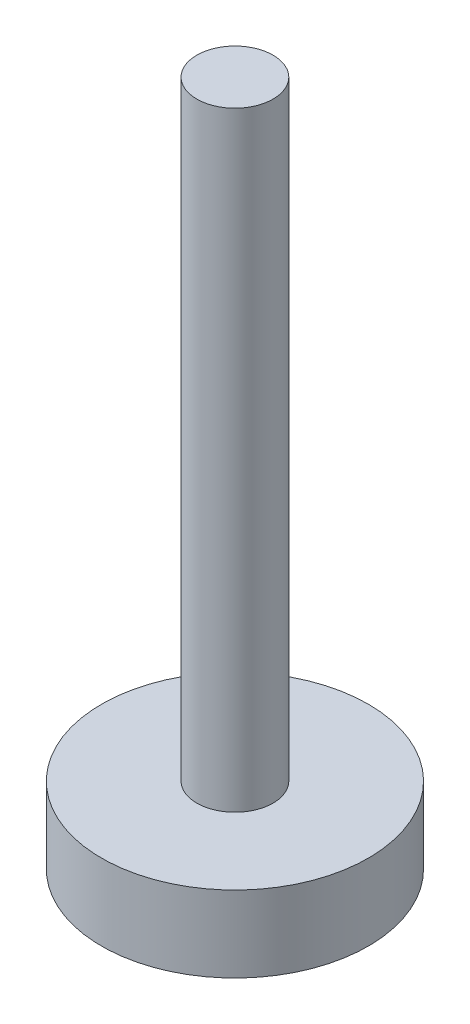
ISO-10303-21;
HEADER;
FILE_DESCRIPTION(('STEP AP214'),'2;1');
FILE_NAME('part.step','',(''),(''),'','','');
FILE_SCHEMA(('AUTOMOTIVE_DESIGN { 1 0 10303 214 1 1 1 1 }'));
ENDSEC;
DATA;
#1=APPLICATION_CONTEXT('core data for automotive mechanical design processes');
#2=APPLICATION_PROTOCOL_DEFINITION('international standard','automotive_design',2000,#1);
#3=PRODUCT_CONTEXT('',#1,'mechanical');
#4=PRODUCT('Part','Part','',(#3));
#5=PRODUCT_RELATED_PRODUCT_CATEGORY('part','',(#4));
#6=PRODUCT_DEFINITION_FORMATION('','',#4);
#7=PRODUCT_DEFINITION_CONTEXT('part definition',#1,'design');
#8=PRODUCT_DEFINITION('design','',#6,#7);
#9=PRODUCT_DEFINITION_SHAPE('','',#8);
#10=(LENGTH_UNIT() NAMED_UNIT(*) SI_UNIT(.MILLI.,.METRE.));
#11=(NAMED_UNIT(*) PLANE_ANGLE_UNIT() SI_UNIT($,.RADIAN.));
#12=(NAMED_UNIT(*) SI_UNIT($,.STERADIAN.) SOLID_ANGLE_UNIT());
#13=UNCERTAINTY_MEASURE_WITH_UNIT(LENGTH_MEASURE(1.E-05),#10,'distance_accuracy_value','');
#14=(GEOMETRIC_REPRESENTATION_CONTEXT(3) GLOBAL_UNCERTAINTY_ASSIGNED_CONTEXT((#13)) GLOBAL_UNIT_ASSIGNED_CONTEXT((#10,
#11,#12)) REPRESENTATION_CONTEXT('',''));
#15=CARTESIAN_POINT('',(0.,0.,0.));
#16=DIRECTION('',(0.,0.,1.));
#17=DIRECTION('',(1.,0.,0.));
#18=AXIS2_PLACEMENT_3D('',#15,#16,#17);
#19=CARTESIAN_POINT('',(0.,80.,0.));
#20=DIRECTION('',(0.,-1.,0.));
#21=DIRECTION('',(0.,0.,-1.));
#22=AXIS2_PLACEMENT_3D('',#19,#20,#21);
#23=CYLINDRICAL_SURFACE('',#22,5.);
#24=CARTESIAN_POINT('',(0.,80.,0.));
#25=DIRECTION('',(0.,1.,0.));
#26=DIRECTION('',(0.,0.,1.));
#27=AXIS2_PLACEMENT_3D('',#24,#25,#26);
#28=CIRCLE('',#27,5.);
#29=CARTESIAN_POINT('',(0.,80.,5.));
#30=VERTEX_POINT('',#29);
#31=EDGE_CURVE('E10',#30,#30,#28,.T.);
#32=ORIENTED_EDGE('',*,*,#31,.F.);
#33=EDGE_LOOP('',(#32));
#34=FACE_BOUND('',#33,.T.);
#35=CARTESIAN_POINT('',(0.,0.,0.));
#36=DIRECTION('',(0.,1.,0.));
#37=DIRECTION('',(0.,0.,1.));
#38=AXIS2_PLACEMENT_3D('',#35,#36,#37);
#39=CIRCLE('',#38,5.);
#40=CARTESIAN_POINT('',(0.,0.,5.));
#41=VERTEX_POINT('',#40);
#42=EDGE_CURVE('E40',#41,#41,#39,.T.);
#43=ORIENTED_EDGE('',*,*,#42,.T.);
#44=EDGE_LOOP('',(#43));
#45=FACE_BOUND('',#44,.T.);
#46=ADVANCED_FACE('F37',(#34,#45),#23,.T.);
#47=CARTESIAN_POINT('',(0.,80.,0.));
#48=DIRECTION('',(0.,1.,0.));
#49=DIRECTION('',(0.,0.,1.));
#50=AXIS2_PLACEMENT_3D('',#47,#48,#49);
#51=PLANE('',#50);
#52=ORIENTED_EDGE('',*,*,#31,.T.);
#53=EDGE_LOOP('',(#52));
#54=FACE_BOUND('',#53,.T.);
#55=ADVANCED_FACE('F64',(#54),#51,.T.);
#56=CARTESIAN_POINT('',(0.,-10.,0.));
#57=DIRECTION('',(0.,1.,0.));
#58=DIRECTION('',(0.,0.,1.));
#59=AXIS2_PLACEMENT_3D('',#56,#57,#58);
#60=CYLINDRICAL_SURFACE('',#59,17.5);
#61=CARTESIAN_POINT('',(0.,-10.,0.));
#62=DIRECTION('',(0.,-1.,0.));
#63=DIRECTION('',(0.,0.,-1.));
#64=AXIS2_PLACEMENT_3D('',#61,#62,#63);
#65=CIRCLE('',#64,17.5);
#66=CARTESIAN_POINT('',(0.,-10.,-17.5));
#67=VERTEX_POINT('',#66);
#68=EDGE_CURVE('E49',#67,#67,#65,.T.);
#69=ORIENTED_EDGE('',*,*,#68,.F.);
#70=EDGE_LOOP('',(#69));
#71=FACE_BOUND('',#70,.T.);
#72=CARTESIAN_POINT('',(0.,0.,0.));
#73=DIRECTION('',(0.,-1.,0.));
#74=DIRECTION('',(0.,0.,-1.));
#75=AXIS2_PLACEMENT_3D('',#72,#73,#74);
#76=CIRCLE('',#75,17.5);
#77=CARTESIAN_POINT('',(0.,0.,-17.5));
#78=VERTEX_POINT('',#77);
#79=EDGE_CURVE('E51',#78,#78,#76,.T.);
#80=ORIENTED_EDGE('',*,*,#79,.T.);
#81=EDGE_LOOP('',(#80));
#82=FACE_BOUND('',#81,.T.);
#83=ADVANCED_FACE('F61',(#71,#82),#60,.T.);
#84=CARTESIAN_POINT('',(0.,-10.,0.));
#85=DIRECTION('',(0.,-1.,0.));
#86=DIRECTION('',(0.,0.,-1.));
#87=AXIS2_PLACEMENT_3D('',#84,#85,#86);
#88=PLANE('',#87);
#89=ORIENTED_EDGE('',*,*,#68,.T.);
#90=EDGE_LOOP('',(#89));
#91=FACE_BOUND('',#90,.T.);
#92=ADVANCED_FACE('F59',(#91),#88,.T.);
#93=CARTESIAN_POINT('',(0.,0.,0.));
#94=DIRECTION('',(0.,-1.,0.));
#95=DIRECTION('',(0.,0.,-1.));
#96=AXIS2_PLACEMENT_3D('',#93,#94,#95);
#97=PLANE('',#96);
#98=ORIENTED_EDGE('',*,*,#42,.F.);
#99=EDGE_LOOP('',(#98));
#100=FACE_BOUND('',#99,.T.);
#101=ORIENTED_EDGE('',*,*,#79,.F.);
#102=EDGE_LOOP('',(#101));
#103=FACE_BOUND('',#102,.T.);
#104=ADVANCED_FACE('F68',(#100,#103),#97,.F.);
#105=CLOSED_SHELL('',(#46,#55,#83,#92,#104));
#106=MANIFOLD_SOLID_BREP('B2',#105);
#107=ADVANCED_BREP_SHAPE_REPRESENTATION('',(#18,#106),#14);
#108=SHAPE_DEFINITION_REPRESENTATION(#9,#107);
ENDSEC;
END-ISO-10303-21;
